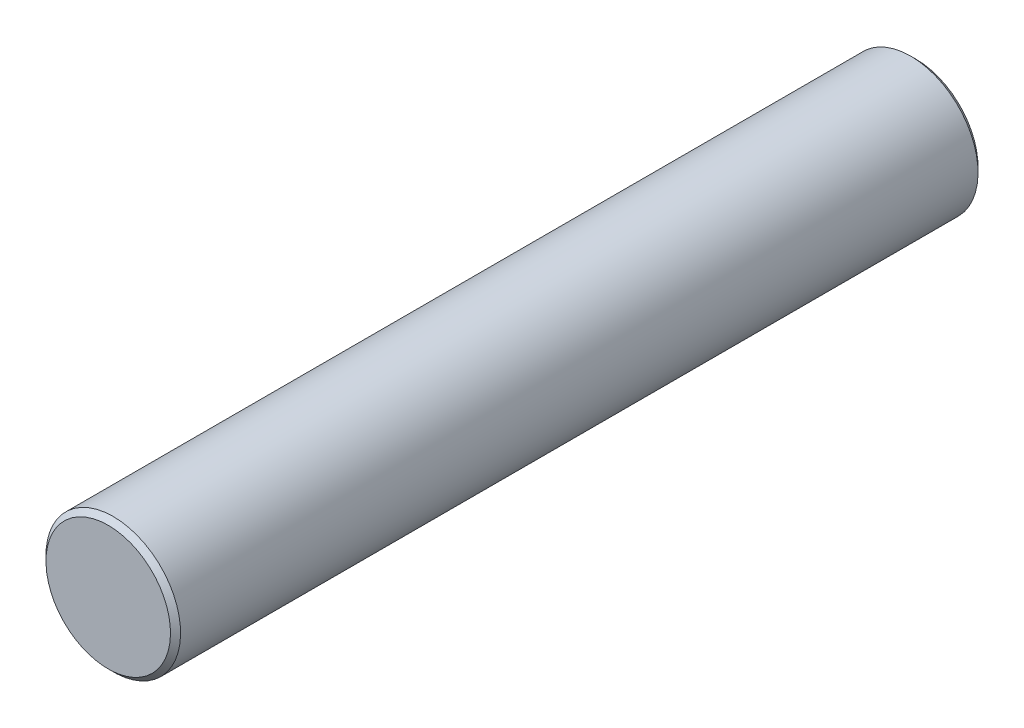
ISO-10303-21;
HEADER;
FILE_DESCRIPTION(('STEP AP214'),'2;1');
FILE_NAME('part.step','',(''),(''),'','','');
FILE_SCHEMA(('AUTOMOTIVE_DESIGN { 1 0 10303 214 1 1 1 1 }'));
ENDSEC;
DATA;
#1=APPLICATION_CONTEXT('core data for automotive mechanical design processes');
#2=APPLICATION_PROTOCOL_DEFINITION('international standard','automotive_design',2000,#1);
#3=PRODUCT_CONTEXT('',#1,'mechanical');
#4=PRODUCT('Part','Part','',(#3));
#5=PRODUCT_RELATED_PRODUCT_CATEGORY('part','',(#4));
#6=PRODUCT_DEFINITION_FORMATION('','',#4);
#7=PRODUCT_DEFINITION_CONTEXT('part definition',#1,'design');
#8=PRODUCT_DEFINITION('design','',#6,#7);
#9=PRODUCT_DEFINITION_SHAPE('','',#8);
#10=(LENGTH_UNIT() NAMED_UNIT(*) SI_UNIT(.MILLI.,.METRE.));
#11=(NAMED_UNIT(*) PLANE_ANGLE_UNIT() SI_UNIT($,.RADIAN.));
#12=(NAMED_UNIT(*) SI_UNIT($,.STERADIAN.) SOLID_ANGLE_UNIT());
#13=UNCERTAINTY_MEASURE_WITH_UNIT(LENGTH_MEASURE(1.E-05),#10,'distance_accuracy_value','');
#14=(GEOMETRIC_REPRESENTATION_CONTEXT(3) GLOBAL_UNCERTAINTY_ASSIGNED_CONTEXT((#13)) GLOBAL_UNIT_ASSIGNED_CONTEXT((#10,
#11,#12)) REPRESENTATION_CONTEXT('',''));
#15=CARTESIAN_POINT('',(0.,0.,0.));
#16=DIRECTION('',(0.,0.,1.));
#17=DIRECTION('',(1.,0.,0.));
#18=AXIS2_PLACEMENT_3D('',#15,#16,#17);
#19=CARTESIAN_POINT('',(0.,9.25,0.));
#20=DIRECTION('',(0.,0.,-1.));
#21=DIRECTION('',(0.,1.,0.));
#22=AXIS2_PLACEMENT_3D('',#19,#20,#21);
#23=PLANE('',#22);
#24=CARTESIAN_POINT('',(0.,0.,0.));
#25=DIRECTION('',(0.,0.,-1.));
#26=DIRECTION('',(0.,1.,0.));
#27=AXIS2_PLACEMENT_3D('',#24,#25,#26);
#28=CIRCLE('',#27,18.5);
#29=CARTESIAN_POINT('',(0.,18.5,0.));
#30=VERTEX_POINT('',#29);
#31=EDGE_CURVE('E9',#30,#30,#28,.T.);
#32=ORIENTED_EDGE('',*,*,#31,.T.);
#33=EDGE_LOOP('',(#32));
#34=FACE_BOUND('',#33,.T.);
#35=CARTESIAN_POINT('',(0.,0.,0.));
#36=DIRECTION('',(0.,0.,1.));
#37=DIRECTION('',(-1.,0.,0.));
#38=AXIS2_PLACEMENT_3D('',#35,#36,#37);
#39=CIRCLE('',#38,6.);
#40=CARTESIAN_POINT('',(-6.,0.,0.));
#41=VERTEX_POINT('',#40);
#42=EDGE_CURVE('E68',#41,#41,#39,.T.);
#43=ORIENTED_EDGE('',*,*,#42,.T.);
#44=EDGE_LOOP('',(#43));
#45=FACE_BOUND('',#44,.T.);
#46=ADVANCED_FACE('F15',(#34,#45),#23,.T.);
#47=CARTESIAN_POINT('',(0.,0.,0.75));
#48=DIRECTION('',(0.,0.,1.));
#49=DIRECTION('',(0.,1.,0.));
#50=AXIS2_PLACEMENT_3D('',#47,#48,#49);
#51=CONICAL_SURFACE('',#50,19.25,0.785398163397448);
#52=CARTESIAN_POINT('',(0.,0.,1.5));
#53=DIRECTION('',(0.,0.,-1.));
#54=DIRECTION('',(0.,1.,0.));
#55=AXIS2_PLACEMENT_3D('',#52,#53,#54);
#56=CIRCLE('',#55,20.);
#57=CARTESIAN_POINT('',(0.,20.,1.5));
#58=VERTEX_POINT('',#57);
#59=EDGE_CURVE('E22',#58,#58,#56,.T.);
#60=ORIENTED_EDGE('',*,*,#59,.T.);
#61=EDGE_LOOP('',(#60));
#62=FACE_BOUND('',#61,.T.);
#63=ORIENTED_EDGE('',*,*,#31,.F.);
#64=EDGE_LOOP('',(#63));
#65=FACE_BOUND('',#64,.T.);
#66=ADVANCED_FACE('F113',(#62,#65),#51,.T.);
#67=CARTESIAN_POINT('',(0.,0.,120.));
#68=DIRECTION('',(0.,0.,1.));
#69=DIRECTION('',(0.,1.,0.));
#70=AXIS2_PLACEMENT_3D('',#67,#68,#69);
#71=CYLINDRICAL_SURFACE('',#70,20.);
#72=CARTESIAN_POINT('',(0.,0.,238.5));
#73=DIRECTION('',(0.,0.,-1.));
#74=DIRECTION('',(0.,1.,0.));
#75=AXIS2_PLACEMENT_3D('',#72,#73,#74);
#76=CIRCLE('',#75,20.);
#77=CARTESIAN_POINT('',(0.,20.,238.5));
#78=VERTEX_POINT('',#77);
#79=EDGE_CURVE('E65',#78,#78,#76,.T.);
#80=ORIENTED_EDGE('',*,*,#79,.T.);
#81=EDGE_LOOP('',(#80));
#82=FACE_BOUND('',#81,.T.);
#83=ORIENTED_EDGE('',*,*,#59,.F.);
#84=EDGE_LOOP('',(#83));
#85=FACE_BOUND('',#84,.T.);
#86=CARTESIAN_POINT('',(0.,0.,6.5));
#87=DIRECTION('',(0.,0.,-1.));
#88=DIRECTION('',(0.,1.,0.));
#89=AXIS2_PLACEMENT_3D('',#86,#87,#88);
#90=CIRCLE('',#89,20.);
#91=CARTESIAN_POINT('',(10.5356537528527,-17.,6.5));
#92=VERTEX_POINT('',#91);
#93=CARTESIAN_POINT('',(-10.5356537528527,-17.,6.5));
#94=VERTEX_POINT('',#93);
#95=EDGE_CURVE('E81',#92,#94,#90,.T.);
#96=ORIENTED_EDGE('',*,*,#95,.T.);
#97=DIRECTION('',(0.,0.,1.));
#98=VECTOR('',#97,1.);
#99=CARTESIAN_POINT('',(-10.5356537528527,-17.,8.25));
#100=LINE('',#99,#98);
#101=CARTESIAN_POINT('',(-10.5356537528527,-17.,10.));
#102=VERTEX_POINT('',#101);
#103=EDGE_CURVE('E75',#94,#102,#100,.T.);
#104=ORIENTED_EDGE('',*,*,#103,.T.);
#105=CARTESIAN_POINT('',(0.,0.,10.));
#106=DIRECTION('',(0.,0.,1.));
#107=DIRECTION('',(0.,1.,0.));
#108=AXIS2_PLACEMENT_3D('',#105,#106,#107);
#109=CIRCLE('',#108,20.);
#110=CARTESIAN_POINT('',(10.5356537528527,-17.,10.));
#111=VERTEX_POINT('',#110);
#112=EDGE_CURVE('E87',#102,#111,#109,.T.);
#113=ORIENTED_EDGE('',*,*,#112,.T.);
#114=DIRECTION('',(0.,0.,-1.));
#115=VECTOR('',#114,1.);
#116=CARTESIAN_POINT('',(10.5356537528527,-17.,8.25));
#117=LINE('',#116,#115);
#118=EDGE_CURVE('E74',#111,#92,#117,.T.);
#119=ORIENTED_EDGE('',*,*,#118,.T.);
#120=EDGE_LOOP('',(#96,#104,#113,#119));
#121=FACE_BOUND('',#120,.T.);
#122=ADVANCED_FACE('F92',(#82,#85,#121),#71,.T.);
#123=CARTESIAN_POINT('',(0.,0.,239.25));
#124=DIRECTION('',(0.,0.,-1.));
#125=DIRECTION('',(0.,1.,0.));
#126=AXIS2_PLACEMENT_3D('',#123,#124,#125);
#127=CONICAL_SURFACE('',#126,19.25,0.785398163397448);
#128=CARTESIAN_POINT('',(0.,0.,240.));
#129=DIRECTION('',(0.,0.,-1.));
#130=DIRECTION('',(0.,1.,0.));
#131=AXIS2_PLACEMENT_3D('',#128,#129,#130);
#132=CIRCLE('',#131,18.5);
#133=CARTESIAN_POINT('',(0.,18.5,240.));
#134=VERTEX_POINT('',#133);
#135=EDGE_CURVE('E61',#134,#134,#132,.T.);
#136=ORIENTED_EDGE('',*,*,#135,.T.);
#137=EDGE_LOOP('',(#136));
#138=FACE_BOUND('',#137,.T.);
#139=ORIENTED_EDGE('',*,*,#79,.F.);
#140=EDGE_LOOP('',(#139));
#141=FACE_BOUND('',#140,.T.);
#142=ADVANCED_FACE('F62',(#138,#141),#127,.T.);
#143=CARTESIAN_POINT('',(0.,9.25,240.));
#144=DIRECTION('',(0.,0.,1.));
#145=DIRECTION('',(0.,-1.,0.));
#146=AXIS2_PLACEMENT_3D('',#143,#144,#145);
#147=PLANE('',#146);
#148=ORIENTED_EDGE('',*,*,#135,.F.);
#149=EDGE_LOOP('',(#148));
#150=FACE_BOUND('',#149,.T.);
#151=ADVANCED_FACE('F135',(#150),#147,.T.);
#152=CARTESIAN_POINT('',(0.,0.,26.4586213285198));
#153=DIRECTION('',(0.,0.,-1.));
#154=DIRECTION('',(-1.,0.,0.));
#155=AXIS2_PLACEMENT_3D('',#152,#153,#154);
#156=CONICAL_SURFACE('',#155,2.52640625,1.0471975511966);
#157=CARTESIAN_POINT('',(0.,0.,25.));
#158=DIRECTION('',(0.,0.,1.));
#159=DIRECTION('',(-1.,0.,0.));
#160=AXIS2_PLACEMENT_3D('',#157,#158,#159);
#161=CIRCLE('',#160,5.0528125);
#162=CARTESIAN_POINT('',(-5.0528125,0.,25.));
#163=VERTEX_POINT('',#162);
#164=EDGE_CURVE('E66',#163,#163,#161,.T.);
#165=ORIENTED_EDGE('',*,*,#164,.F.);
#166=EDGE_LOOP('',(#165));
#167=FACE_BOUND('',#166,.T.);
#168=CARTESIAN_POINT('',(0.,0.,27.9172426570397));
#169=VERTEX_POINT('',#168);
#170=VERTEX_LOOP('',#169);
#171=FACE_BOUND('',#170,.T.);
#172=ADVANCED_FACE('F129',(#167,#171),#156,.F.);
#173=CARTESIAN_POINT('',(0.,0.,12.97359375));
#174=DIRECTION('',(0.,0.,-1.));
#175=DIRECTION('',(-1.,0.,0.));
#176=AXIS2_PLACEMENT_3D('',#173,#174,#175);
#177=CYLINDRICAL_SURFACE('',#176,5.0528125);
#178=CARTESIAN_POINT('',(0.,0.,0.9471875));
#179=DIRECTION('',(0.,0.,1.));
#180=DIRECTION('',(-1.,0.,0.));
#181=AXIS2_PLACEMENT_3D('',#178,#179,#180);
#182=CIRCLE('',#181,5.0528125);
#183=CARTESIAN_POINT('',(-5.0528125,0.,0.9471875));
#184=VERTEX_POINT('',#183);
#185=EDGE_CURVE('E72',#184,#184,#182,.T.);
#186=ORIENTED_EDGE('',*,*,#185,.F.);
#187=EDGE_LOOP('',(#186));
#188=FACE_BOUND('',#187,.T.);
#189=ORIENTED_EDGE('',*,*,#164,.T.);
#190=EDGE_LOOP('',(#189));
#191=FACE_BOUND('',#190,.T.);
#192=ADVANCED_FACE('F123',(#188,#191),#177,.F.);
#193=CARTESIAN_POINT('',(0.,0.,0.47359375));
#194=DIRECTION('',(0.,0.,-1.));
#195=DIRECTION('',(-1.,0.,0.));
#196=AXIS2_PLACEMENT_3D('',#193,#194,#195);
#197=CONICAL_SURFACE('',#196,5.52640625,0.785398163397448);
#198=ORIENTED_EDGE('',*,*,#42,.F.);
#199=EDGE_LOOP('',(#198));
#200=FACE_BOUND('',#199,.T.);
#201=ORIENTED_EDGE('',*,*,#185,.T.);
#202=EDGE_LOOP('',(#201));
#203=FACE_BOUND('',#202,.T.);
#204=ADVANCED_FACE('F110',(#200,#203),#197,.F.);
#205=CARTESIAN_POINT('',(0.,-17.,8.25));
#206=DIRECTION('',(0.,-1.,0.));
#207=DIRECTION('',(0.,0.,-1.));
#208=AXIS2_PLACEMENT_3D('',#205,#206,#207);
#209=PLANE('',#208);
#210=ORIENTED_EDGE('',*,*,#103,.F.);
#211=DIRECTION('',(1.,0.,0.));
#212=VECTOR('',#211,1.);
#213=CARTESIAN_POINT('',(0.,-17.,6.5));
#214=LINE('',#213,#212);
#215=EDGE_CURVE('E78',#94,#92,#214,.T.);
#216=ORIENTED_EDGE('',*,*,#215,.T.);
#217=ORIENTED_EDGE('',*,*,#118,.F.);
#218=DIRECTION('',(-1.,0.,0.));
#219=VECTOR('',#218,1.);
#220=CARTESIAN_POINT('',(0.,-17.,10.));
#221=LINE('',#220,#219);
#222=EDGE_CURVE('E84',#111,#102,#221,.T.);
#223=ORIENTED_EDGE('',*,*,#222,.T.);
#224=EDGE_LOOP('',(#210,#216,#217,#223));
#225=FACE_BOUND('',#224,.T.);
#226=ADVANCED_FACE('F97',(#225),#209,.T.);
#227=CARTESIAN_POINT('',(0.,-19.5,6.5));
#228=DIRECTION('',(0.,0.,1.));
#229=DIRECTION('',(1.,0.,0.));
#230=AXIS2_PLACEMENT_3D('',#227,#228,#229);
#231=PLANE('',#230);
#232=ORIENTED_EDGE('',*,*,#95,.F.);
#233=ORIENTED_EDGE('',*,*,#215,.F.);
#234=EDGE_LOOP('',(#232,#233));
#235=FACE_BOUND('',#234,.T.);
#236=ADVANCED_FACE('F101',(#235),#231,.T.);
#237=CARTESIAN_POINT('',(0.,-19.5,10.));
#238=DIRECTION('',(0.,0.,1.));
#239=DIRECTION('',(1.,0.,0.));
#240=AXIS2_PLACEMENT_3D('',#237,#238,#239);
#241=PLANE('',#240);
#242=ORIENTED_EDGE('',*,*,#112,.F.);
#243=ORIENTED_EDGE('',*,*,#222,.F.);
#244=EDGE_LOOP('',(#242,#243));
#245=FACE_BOUND('',#244,.T.);
#246=ADVANCED_FACE('F95',(#245),#241,.F.);
#247=CLOSED_SHELL('',(#46,#66,#122,#142,#151,#172,#192,#204,#226,#236,#246));
#248=MANIFOLD_SOLID_BREP('B1',#247);
#249=ADVANCED_BREP_SHAPE_REPRESENTATION('',(#18,#248),#14);
#250=SHAPE_DEFINITION_REPRESENTATION(#9,#249);
ENDSEC;
END-ISO-10303-21;
